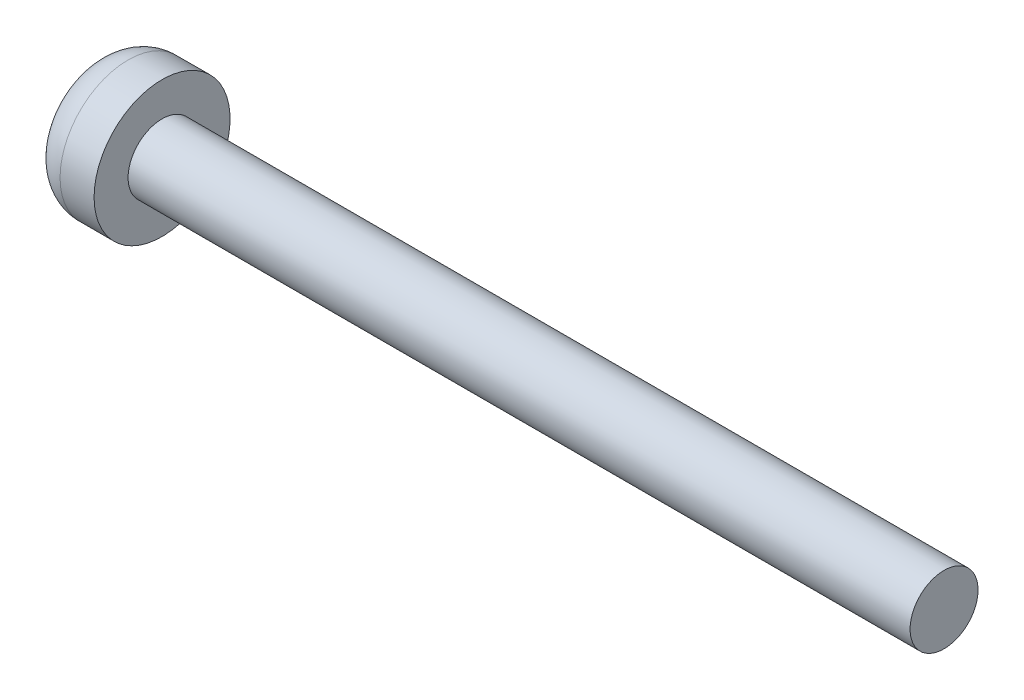
ISO-10303-21;
HEADER;
FILE_DESCRIPTION(('STEP AP214'),'2;1');
FILE_NAME('part.step','',(''),(''),'','','');
FILE_SCHEMA(('AUTOMOTIVE_DESIGN { 1 0 10303 214 1 1 1 1 }'));
ENDSEC;
DATA;
#1=APPLICATION_CONTEXT('core data for automotive mechanical design processes');
#2=APPLICATION_PROTOCOL_DEFINITION('international standard','automotive_design',2000,#1);
#3=PRODUCT_CONTEXT('',#1,'mechanical');
#4=PRODUCT('Part','Part','',(#3));
#5=PRODUCT_RELATED_PRODUCT_CATEGORY('part','',(#4));
#6=PRODUCT_DEFINITION_FORMATION('','',#4);
#7=PRODUCT_DEFINITION_CONTEXT('part definition',#1,'design');
#8=PRODUCT_DEFINITION('design','',#6,#7);
#9=PRODUCT_DEFINITION_SHAPE('','',#8);
#10=(LENGTH_UNIT() NAMED_UNIT(*) SI_UNIT(.MILLI.,.METRE.));
#11=(NAMED_UNIT(*) PLANE_ANGLE_UNIT() SI_UNIT($,.RADIAN.));
#12=(NAMED_UNIT(*) SI_UNIT($,.STERADIAN.) SOLID_ANGLE_UNIT());
#13=UNCERTAINTY_MEASURE_WITH_UNIT(LENGTH_MEASURE(1.E-05),#10,'distance_accuracy_value','');
#14=(GEOMETRIC_REPRESENTATION_CONTEXT(3) GLOBAL_UNCERTAINTY_ASSIGNED_CONTEXT((#13)) GLOBAL_UNIT_ASSIGNED_CONTEXT((#10,
#11,#12)) REPRESENTATION_CONTEXT('',''));
#15=CARTESIAN_POINT('',(0.,0.,0.));
#16=DIRECTION('',(0.,0.,1.));
#17=DIRECTION('',(1.,0.,0.));
#18=AXIS2_PLACEMENT_3D('',#15,#16,#17);
#19=CARTESIAN_POINT('',(2.,0.,0.));
#20=DIRECTION('',(-1.,0.,0.));
#21=DIRECTION('',(0.,0.,1.));
#22=AXIS2_PLACEMENT_3D('',#19,#20,#21);
#23=PLANE('',#22);
#24=CARTESIAN_POINT('',(2.,0.,0.));
#25=DIRECTION('',(-1.,0.,0.));
#26=DIRECTION('',(0.,0.,1.));
#27=AXIS2_PLACEMENT_3D('',#24,#25,#26);
#28=CIRCLE('',#27,2.);
#29=CARTESIAN_POINT('',(2.,0.,2.));
#30=VERTEX_POINT('',#29);
#31=EDGE_CURVE('E53',#30,#30,#28,.T.);
#32=ORIENTED_EDGE('',*,*,#31,.F.);
#33=EDGE_LOOP('',(#32));
#34=FACE_BOUND('',#33,.T.);
#35=CARTESIAN_POINT('',(2.,0.,0.));
#36=DIRECTION('',(-1.,0.,0.));
#37=DIRECTION('',(0.,0.,1.));
#38=AXIS2_PLACEMENT_3D('',#35,#36,#37);
#39=CIRCLE('',#38,0.999999999999997);
#40=CARTESIAN_POINT('',(2.,0.,0.999999999999997));
#41=VERTEX_POINT('',#40);
#42=EDGE_CURVE('E48',#41,#41,#39,.T.);
#43=ORIENTED_EDGE('',*,*,#42,.T.);
#44=EDGE_LOOP('',(#43));
#45=FACE_BOUND('',#44,.T.);
#46=ADVANCED_FACE('F33',(#34,#45),#23,.F.);
#47=CARTESIAN_POINT('',(0.,0.,0.));
#48=DIRECTION('',(-1.,0.,0.));
#49=DIRECTION('',(0.,0.,1.));
#50=AXIS2_PLACEMENT_3D('',#47,#48,#49);
#51=CYLINDRICAL_SURFACE('',#50,2.);
#52=CARTESIAN_POINT('',(1.,0.,0.));
#53=DIRECTION('',(1.,0.,0.));
#54=DIRECTION('',(0.,0.,-1.));
#55=AXIS2_PLACEMENT_3D('',#52,#53,#54);
#56=CIRCLE('',#55,2.);
#57=CARTESIAN_POINT('',(1.,0.,-2.));
#58=VERTEX_POINT('',#57);
#59=EDGE_CURVE('E10',#58,#58,#56,.T.);
#60=ORIENTED_EDGE('',*,*,#59,.T.);
#61=EDGE_LOOP('',(#60));
#62=FACE_BOUND('',#61,.T.);
#63=ORIENTED_EDGE('',*,*,#31,.T.);
#64=EDGE_LOOP('',(#63));
#65=FACE_BOUND('',#64,.T.);
#66=ADVANCED_FACE('F57',(#62,#65),#51,.T.);
#67=CARTESIAN_POINT('',(0.,0.,0.));
#68=DIRECTION('',(-1.,0.,0.));
#69=DIRECTION('',(0.,0.,1.));
#70=AXIS2_PLACEMENT_3D('',#67,#68,#69);
#71=CYLINDRICAL_SURFACE('',#70,0.999999999999999);
#72=ORIENTED_EDGE('',*,*,#42,.F.);
#73=EDGE_LOOP('',(#72));
#74=FACE_BOUND('',#73,.T.);
#75=CARTESIAN_POINT('',(25.,0.,0.));
#76=DIRECTION('',(-1.,0.,0.));
#77=DIRECTION('',(0.,0.,1.));
#78=AXIS2_PLACEMENT_3D('',#75,#76,#77);
#79=CIRCLE('',#78,1.);
#80=CARTESIAN_POINT('',(25.,0.,1.));
#81=VERTEX_POINT('',#80);
#82=EDGE_CURVE('E44',#81,#81,#79,.T.);
#83=ORIENTED_EDGE('',*,*,#82,.T.);
#84=EDGE_LOOP('',(#83));
#85=FACE_BOUND('',#84,.T.);
#86=ADVANCED_FACE('F62',(#74,#85),#71,.T.);
#87=CARTESIAN_POINT('',(25.,0.,0.));
#88=DIRECTION('',(-1.,0.,0.));
#89=DIRECTION('',(0.,0.,1.));
#90=AXIS2_PLACEMENT_3D('',#87,#88,#89);
#91=PLANE('',#90);
#92=ORIENTED_EDGE('',*,*,#82,.F.);
#93=EDGE_LOOP('',(#92));
#94=FACE_BOUND('',#93,.T.);
#95=ADVANCED_FACE('F67',(#94),#91,.F.);
#96=CARTESIAN_POINT('',(0.,0.,0.));
#97=DIRECTION('',(1.,0.,0.));
#98=DIRECTION('',(0.,0.,-1.));
#99=AXIS2_PLACEMENT_3D('',#96,#97,#98);
#100=PLANE('',#99);
#101=CARTESIAN_POINT('',(0.,0.,0.));
#102=DIRECTION('',(1.,0.,0.));
#103=DIRECTION('',(0.,0.,-1.));
#104=AXIS2_PLACEMENT_3D('',#101,#102,#103);
#105=CIRCLE('',#104,1.);
#106=CARTESIAN_POINT('',(0.,0.,-1.));
#107=VERTEX_POINT('',#106);
#108=EDGE_CURVE('E40',#107,#107,#105,.F.);
#109=ORIENTED_EDGE('',*,*,#108,.T.);
#110=EDGE_LOOP('',(#109));
#111=FACE_BOUND('',#110,.T.);
#112=ADVANCED_FACE('F72',(#111),#100,.F.);
#113=CARTESIAN_POINT('',(1.,0.,0.));
#114=DIRECTION('',(1.,0.,0.));
#115=DIRECTION('',(0.,0.,-1.));
#116=AXIS2_PLACEMENT_3D('',#113,#114,#115);
#117=DEGENERATE_TOROIDAL_SURFACE('',#116,1.,1.,.T.);
#118=ORIENTED_EDGE('',*,*,#59,.F.);
#119=EDGE_LOOP('',(#118));
#120=FACE_BOUND('',#119,.T.);
#121=ORIENTED_EDGE('',*,*,#108,.F.);
#122=EDGE_LOOP('',(#121));
#123=FACE_BOUND('',#122,.T.);
#124=ADVANCED_FACE('F35',(#120,#123),#117,.T.);
#125=CLOSED_SHELL('',(#46,#66,#86,#95,#112,#124));
#126=MANIFOLD_SOLID_BREP('B2',#125);
#127=ADVANCED_BREP_SHAPE_REPRESENTATION('',(#18,#126),#14);
#128=SHAPE_DEFINITION_REPRESENTATION(#9,#127);
ENDSEC;
END-ISO-10303-21;
